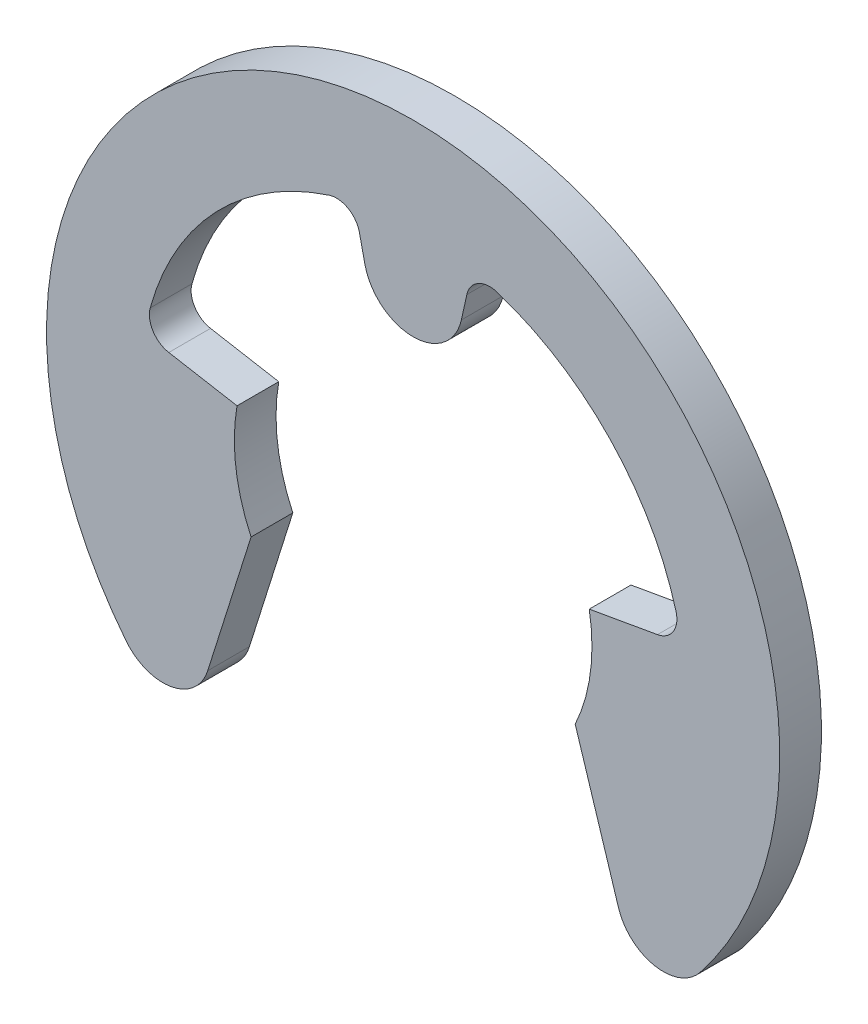
ISO-10303-21;
HEADER;
FILE_DESCRIPTION(('STEP AP214'),'2;1');
FILE_NAME('part.step','',(''),(''),'','','');
FILE_SCHEMA(('AUTOMOTIVE_DESIGN { 1 0 10303 214 1 1 1 1 }'));
ENDSEC;
DATA;
#1=APPLICATION_CONTEXT('core data for automotive mechanical design processes');
#2=APPLICATION_PROTOCOL_DEFINITION('international standard','automotive_design',2000,#1);
#3=PRODUCT_CONTEXT('',#1,'mechanical');
#4=PRODUCT('Part','Part','',(#3));
#5=PRODUCT_RELATED_PRODUCT_CATEGORY('part','',(#4));
#6=PRODUCT_DEFINITION_FORMATION('','',#4);
#7=PRODUCT_DEFINITION_CONTEXT('part definition',#1,'design');
#8=PRODUCT_DEFINITION('design','',#6,#7);
#9=PRODUCT_DEFINITION_SHAPE('','',#8);
#10=(LENGTH_UNIT() NAMED_UNIT(*) SI_UNIT(.MILLI.,.METRE.));
#11=(NAMED_UNIT(*) PLANE_ANGLE_UNIT() SI_UNIT($,.RADIAN.));
#12=(NAMED_UNIT(*) SI_UNIT($,.STERADIAN.) SOLID_ANGLE_UNIT());
#13=UNCERTAINTY_MEASURE_WITH_UNIT(LENGTH_MEASURE(1.E-05),#10,'distance_accuracy_value','');
#14=(GEOMETRIC_REPRESENTATION_CONTEXT(3) GLOBAL_UNCERTAINTY_ASSIGNED_CONTEXT((#13)) GLOBAL_UNIT_ASSIGNED_CONTEXT((#10,
#11,#12)) REPRESENTATION_CONTEXT('',''));
#15=CARTESIAN_POINT('',(0.,0.,0.));
#16=DIRECTION('',(0.,0.,1.));
#17=DIRECTION('',(1.,0.,0.));
#18=AXIS2_PLACEMENT_3D('',#15,#16,#17);
#19=CARTESIAN_POINT('',(0.,0.,-0.7));
#20=DIRECTION('',(0.,0.,1.));
#21=DIRECTION('',(1.,0.,0.));
#22=AXIS2_PLACEMENT_3D('',#19,#20,#21);
#23=CYLINDRICAL_SURFACE('',#22,3.);
#24=CARTESIAN_POINT('',(0.,0.,0.));
#25=DIRECTION('',(0.,0.,-1.));
#26=DIRECTION('',(1.,0.,0.));
#27=AXIS2_PLACEMENT_3D('',#24,#25,#26);
#28=CIRCLE('',#27,3.);
#29=CARTESIAN_POINT('',(2.95442325903663,0.520944533000782,0.));
#30=VERTEX_POINT('',#29);
#31=CARTESIAN_POINT('',(2.71892336110994,-1.26785478522211,0.));
#32=VERTEX_POINT('',#31);
#33=EDGE_CURVE('E198',#30,#32,#28,.T.);
#34=ORIENTED_EDGE('',*,*,#33,.F.);
#35=DIRECTION('',(0.,0.,1.));
#36=VECTOR('',#35,1.);
#37=CARTESIAN_POINT('',(2.95442325903663,0.520944533000782,-0.7));
#38=LINE('',#37,#36);
#39=CARTESIAN_POINT('',(2.95442325903663,0.520944533000782,-0.7));
#40=VERTEX_POINT('',#39);
#41=EDGE_CURVE('E11',#40,#30,#38,.T.);
#42=ORIENTED_EDGE('',*,*,#41,.F.);
#43=CARTESIAN_POINT('',(0.,0.,-0.7));
#44=DIRECTION('',(0.,0.,-1.));
#45=DIRECTION('',(1.,0.,0.));
#46=AXIS2_PLACEMENT_3D('',#43,#44,#45);
#47=CIRCLE('',#46,3.);
#48=CARTESIAN_POINT('',(2.71892336110994,-1.26785478522211,-0.7));
#49=VERTEX_POINT('',#48);
#50=EDGE_CURVE('E248',#40,#49,#47,.T.);
#51=ORIENTED_EDGE('',*,*,#50,.T.);
#52=DIRECTION('',(0.,0.,1.));
#53=VECTOR('',#52,1.);
#54=CARTESIAN_POINT('',(2.71892336110994,-1.26785478522211,-0.7));
#55=LINE('',#54,#53);
#56=EDGE_CURVE('E44',#49,#32,#55,.T.);
#57=ORIENTED_EDGE('',*,*,#56,.T.);
#58=EDGE_LOOP('',(#34,#42,#51,#57));
#59=FACE_BOUND('',#58,.T.);
#60=ADVANCED_FACE('F41',(#59),#23,.F.);
#61=CARTESIAN_POINT('',(2.95442325903663,0.520944533000782,-0.7));
#62=DIRECTION('',(-0.173648177666928,0.984807753012209,0.));
#63=DIRECTION('',(-0.984807753012209,-0.173648177666928,0.));
#64=AXIS2_PLACEMENT_3D('',#61,#62,#63);
#65=PLANE('',#64);
#66=DIRECTION('',(-0.984807753012209,-0.173648177666928,0.));
#67=VECTOR('',#66,1.);
#68=CARTESIAN_POINT('',(2.95442325903663,0.520944533000782,0.));
#69=LINE('',#68,#67);
#70=CARTESIAN_POINT('',(4.09942862119905,0.722839871405881,0.));
#71=VERTEX_POINT('',#70);
#72=EDGE_CURVE('E246',#71,#30,#69,.T.);
#73=ORIENTED_EDGE('',*,*,#72,.F.);
#74=DIRECTION('',(0.,0.,1.));
#75=VECTOR('',#74,1.);
#76=CARTESIAN_POINT('',(4.09942862119905,0.722839871405881,-0.7));
#77=LINE('',#76,#75);
#78=CARTESIAN_POINT('',(4.09942862119905,0.722839871405881,-0.7));
#79=VERTEX_POINT('',#78);
#80=EDGE_CURVE('E50',#79,#71,#77,.T.);
#81=ORIENTED_EDGE('',*,*,#80,.F.);
#82=DIRECTION('',(-0.984807753012209,-0.173648177666928,0.));
#83=VECTOR('',#82,1.);
#84=CARTESIAN_POINT('',(2.95442325903663,0.520944533000782,-0.7));
#85=LINE('',#84,#83);
#86=EDGE_CURVE('E188',#79,#40,#85,.T.);
#87=ORIENTED_EDGE('',*,*,#86,.T.);
#88=ORIENTED_EDGE('',*,*,#41,.T.);
#89=EDGE_LOOP('',(#73,#81,#87,#88));
#90=FACE_BOUND('',#89,.T.);
#91=ADVANCED_FACE('F280',(#90),#65,.T.);
#92=CARTESIAN_POINT('',(4.0310546512427,1.11060792415444,-0.7));
#93=DIRECTION('',(0.,0.,1.));
#94=DIRECTION('',(1.,0.,0.));
#95=AXIS2_PLACEMENT_3D('',#92,#93,#94);
#96=CYLINDRICAL_SURFACE('',#95,0.39375);
#97=CARTESIAN_POINT('',(4.0310546512427,1.11060792415444,0.));
#98=DIRECTION('',(0.,0.,-1.));
#99=DIRECTION('',(1.,0.,0.));
#100=AXIS2_PLACEMENT_3D('',#97,#98,#99);
#101=CIRCLE('',#100,0.39375);
#102=CARTESIAN_POINT('',(4.41066069463326,1.21519432059948,0.));
#103=VERTEX_POINT('',#102);
#104=EDGE_CURVE('E175',#103,#71,#101,.T.);
#105=ORIENTED_EDGE('',*,*,#104,.F.);
#106=DIRECTION('',(0.,0.,1.));
#107=VECTOR('',#106,1.);
#108=CARTESIAN_POINT('',(4.41066069463326,1.21519432059948,-0.7));
#109=LINE('',#108,#107);
#110=CARTESIAN_POINT('',(4.41066069463326,1.21519432059948,-0.7));
#111=VERTEX_POINT('',#110);
#112=EDGE_CURVE('E170',#111,#103,#109,.T.);
#113=ORIENTED_EDGE('',*,*,#112,.F.);
#114=CARTESIAN_POINT('',(4.0310546512427,1.11060792415444,-0.7));
#115=DIRECTION('',(0.,0.,-1.));
#116=DIRECTION('',(1.,0.,0.));
#117=AXIS2_PLACEMENT_3D('',#114,#115,#116);
#118=CIRCLE('',#117,0.39375);
#119=EDGE_CURVE('E173',#111,#79,#118,.T.);
#120=ORIENTED_EDGE('',*,*,#119,.T.);
#121=ORIENTED_EDGE('',*,*,#80,.T.);
#122=EDGE_LOOP('',(#105,#113,#120,#121));
#123=FACE_BOUND('',#122,.T.);
#124=ADVANCED_FACE('F172',(#123),#96,.F.);
#125=CARTESIAN_POINT('',(0.,0.,-0.7));
#126=DIRECTION('',(0.,0.,1.));
#127=DIRECTION('',(1.,0.,0.));
#128=AXIS2_PLACEMENT_3D('',#125,#126,#127);
#129=CYLINDRICAL_SURFACE('',#128,4.575);
#130=CARTESIAN_POINT('',(0.,0.,0.));
#131=DIRECTION('',(0.,0.,-1.));
#132=DIRECTION('',(1.,0.,0.));
#133=AXIS2_PLACEMENT_3D('',#130,#131,#132);
#134=CIRCLE('',#133,4.575);
#135=CARTESIAN_POINT('',(1.40642804224757,4.35345669117997,0.));
#136=VERTEX_POINT('',#135);
#137=EDGE_CURVE('E243',#136,#103,#134,.T.);
#138=ORIENTED_EDGE('',*,*,#137,.F.);
#139=DIRECTION('',(0.,0.,1.));
#140=VECTOR('',#139,1.);
#141=CARTESIAN_POINT('',(1.40642804224757,4.35345669117997,-0.7));
#142=LINE('',#141,#140);
#143=CARTESIAN_POINT('',(1.40642804224757,4.35345669117997,-0.7));
#144=VERTEX_POINT('',#143);
#145=EDGE_CURVE('E180',#144,#136,#142,.T.);
#146=ORIENTED_EDGE('',*,*,#145,.F.);
#147=CARTESIAN_POINT('',(0.,0.,-0.7));
#148=DIRECTION('',(0.,0.,-1.));
#149=DIRECTION('',(1.,0.,0.));
#150=AXIS2_PLACEMENT_3D('',#147,#148,#149);
#151=CIRCLE('',#150,4.575);
#152=EDGE_CURVE('E186',#144,#111,#151,.T.);
#153=ORIENTED_EDGE('',*,*,#152,.T.);
#154=ORIENTED_EDGE('',*,*,#112,.T.);
#155=EDGE_LOOP('',(#138,#146,#153,#154));
#156=FACE_BOUND('',#155,.T.);
#157=ADVANCED_FACE('F190',(#156),#129,.F.);
#158=CARTESIAN_POINT('',(1.28538300582462,3.97877394316858,-0.7));
#159=DIRECTION('',(0.,0.,1.));
#160=DIRECTION('',(1.,0.,0.));
#161=AXIS2_PLACEMENT_3D('',#158,#159,#160);
#162=CYLINDRICAL_SURFACE('',#161,0.39375);
#163=CARTESIAN_POINT('',(1.28538300582462,3.97877394316858,0.));
#164=DIRECTION('',(0.,0.,-1.));
#165=DIRECTION('',(1.,0.,0.));
#166=AXIS2_PLACEMENT_3D('',#163,#164,#165);
#167=CIRCLE('',#166,0.39375);
#168=CARTESIAN_POINT('',(0.900966453021147,4.06399704115671,0.));
#169=VERTEX_POINT('',#168);
#170=EDGE_CURVE('E240',#169,#136,#167,.T.);
#171=ORIENTED_EDGE('',*,*,#170,.F.);
#172=DIRECTION('',(0.,0.,1.));
#173=VECTOR('',#172,1.);
#174=CARTESIAN_POINT('',(0.900966453021147,4.06399704115671,-0.7));
#175=LINE('',#174,#173);
#176=CARTESIAN_POINT('',(0.900966453021147,4.06399704115671,-0.7));
#177=VERTEX_POINT('',#176);
#178=EDGE_CURVE('E252',#177,#169,#175,.T.);
#179=ORIENTED_EDGE('',*,*,#178,.F.);
#180=CARTESIAN_POINT('',(1.28538300582462,3.97877394316858,-0.7));
#181=DIRECTION('',(0.,0.,-1.));
#182=DIRECTION('',(1.,0.,0.));
#183=AXIS2_PLACEMENT_3D('',#180,#181,#182);
#184=CIRCLE('',#183,0.39375);
#185=EDGE_CURVE('E191',#177,#144,#184,.T.);
#186=ORIENTED_EDGE('',*,*,#185,.T.);
#187=ORIENTED_EDGE('',*,*,#145,.T.);
#188=EDGE_LOOP('',(#171,#179,#186,#187));
#189=FACE_BOUND('',#188,.T.);
#190=ADVANCED_FACE('F293',(#189),#162,.F.);
#191=CARTESIAN_POINT('',(0.809034509512549,3.6493188418143,-0.7));
#192=DIRECTION('',(0.976296007119933,-0.216439613938103,0.));
#193=DIRECTION('',(0.216439613938103,0.976296007119933,0.));
#194=AXIS2_PLACEMENT_3D('',#191,#192,#193);
#195=PLANE('',#194);
#196=DIRECTION('',(0.216439613938103,0.976296007119933,0.));
#197=VECTOR('',#196,1.);
#198=CARTESIAN_POINT('',(0.809034509512549,3.6493188418143,0.));
#199=LINE('',#198,#197);
#200=CARTESIAN_POINT('',(0.809034509512549,3.6493188418143,0.));
#201=VERTEX_POINT('',#200);
#202=EDGE_CURVE('E237',#201,#169,#199,.T.);
#203=ORIENTED_EDGE('',*,*,#202,.F.);
#204=DIRECTION('',(0.,0.,1.));
#205=VECTOR('',#204,1.);
#206=CARTESIAN_POINT('',(0.809034509512549,3.6493188418143,-0.7));
#207=LINE('',#206,#205);
#208=CARTESIAN_POINT('',(0.809034509512549,3.6493188418143,-0.7));
#209=VERTEX_POINT('',#208);
#210=EDGE_CURVE('E254',#209,#201,#207,.T.);
#211=ORIENTED_EDGE('',*,*,#210,.F.);
#212=DIRECTION('',(0.216439613938103,0.976296007119933,0.));
#213=VECTOR('',#212,1.);
#214=CARTESIAN_POINT('',(0.809034509512549,3.6493188418143,-0.7));
#215=LINE('',#214,#213);
#216=EDGE_CURVE('E193',#209,#177,#215,.T.);
#217=ORIENTED_EDGE('',*,*,#216,.T.);
#218=ORIENTED_EDGE('',*,*,#178,.T.);
#219=EDGE_LOOP('',(#203,#211,#217,#218));
#220=FACE_BOUND('',#219,.T.);
#221=ADVANCED_FACE('F296',(#220),#195,.T.);
#222=CARTESIAN_POINT('',(0.,3.82867747446718,-0.7));
#223=DIRECTION('',(0.,0.,1.));
#224=DIRECTION('',(1.,0.,0.));
#225=AXIS2_PLACEMENT_3D('',#222,#223,#224);
#226=CYLINDRICAL_SURFACE('',#225,0.828677474467191);
#227=CARTESIAN_POINT('',(0.,3.82867747446718,0.));
#228=DIRECTION('',(0.,0.,1.));
#229=DIRECTION('',(1.,0.,0.));
#230=AXIS2_PLACEMENT_3D('',#227,#228,#229);
#231=CIRCLE('',#230,0.828677474467191);
#232=CARTESIAN_POINT('',(-0.809034509512549,3.6493188418143,0.));
#233=VERTEX_POINT('',#232);
#234=EDGE_CURVE('E234',#233,#201,#231,.T.);
#235=ORIENTED_EDGE('',*,*,#234,.F.);
#236=DIRECTION('',(0.,0.,1.));
#237=VECTOR('',#236,1.);
#238=CARTESIAN_POINT('',(-0.809034509512549,3.6493188418143,-0.7));
#239=LINE('',#238,#237);
#240=CARTESIAN_POINT('',(-0.809034509512549,3.6493188418143,-0.7));
#241=VERTEX_POINT('',#240);
#242=EDGE_CURVE('E256',#241,#233,#239,.T.);
#243=ORIENTED_EDGE('',*,*,#242,.F.);
#244=CARTESIAN_POINT('',(0.,3.82867747446718,-0.7));
#245=DIRECTION('',(0.,0.,1.));
#246=DIRECTION('',(1.,0.,0.));
#247=AXIS2_PLACEMENT_3D('',#244,#245,#246);
#248=CIRCLE('',#247,0.828677474467191);
#249=EDGE_CURVE('E464',#241,#209,#248,.T.);
#250=ORIENTED_EDGE('',*,*,#249,.T.);
#251=ORIENTED_EDGE('',*,*,#210,.T.);
#252=EDGE_LOOP('',(#235,#243,#250,#251));
#253=FACE_BOUND('',#252,.T.);
#254=ADVANCED_FACE('F300',(#253),#226,.T.);
#255=CARTESIAN_POINT('',(-0.809034509512549,3.6493188418143,-0.7));
#256=DIRECTION('',(-0.976296007119933,-0.216439613938103,0.));
#257=DIRECTION('',(0.216439613938103,-0.976296007119933,0.));
#258=AXIS2_PLACEMENT_3D('',#255,#256,#257);
#259=PLANE('',#258);
#260=DIRECTION('',(0.216439613938103,-0.976296007119933,0.));
#261=VECTOR('',#260,1.);
#262=CARTESIAN_POINT('',(-0.809034509512549,3.6493188418143,0.));
#263=LINE('',#262,#261);
#264=CARTESIAN_POINT('',(-0.900966453021146,4.06399704115671,0.));
#265=VERTEX_POINT('',#264);
#266=EDGE_CURVE('E231',#265,#233,#263,.T.);
#267=ORIENTED_EDGE('',*,*,#266,.F.);
#268=DIRECTION('',(0.,0.,1.));
#269=VECTOR('',#268,1.);
#270=CARTESIAN_POINT('',(-0.900966453021146,4.06399704115671,-0.7));
#271=LINE('',#270,#269);
#272=CARTESIAN_POINT('',(-0.900966453021146,4.06399704115671,-0.7));
#273=VERTEX_POINT('',#272);
#274=EDGE_CURVE('E258',#273,#265,#271,.T.);
#275=ORIENTED_EDGE('',*,*,#274,.F.);
#276=DIRECTION('',(0.216439613938103,-0.976296007119933,0.));
#277=VECTOR('',#276,1.);
#278=CARTESIAN_POINT('',(-0.809034509512549,3.6493188418143,-0.7));
#279=LINE('',#278,#277);
#280=EDGE_CURVE('E468',#273,#241,#279,.T.);
#281=ORIENTED_EDGE('',*,*,#280,.T.);
#282=ORIENTED_EDGE('',*,*,#242,.T.);
#283=EDGE_LOOP('',(#267,#275,#281,#282));
#284=FACE_BOUND('',#283,.T.);
#285=ADVANCED_FACE('F304',(#284),#259,.T.);
#286=CARTESIAN_POINT('',(-1.28538300582462,3.97877394316858,-0.7));
#287=DIRECTION('',(0.,0.,1.));
#288=DIRECTION('',(1.,0.,0.));
#289=AXIS2_PLACEMENT_3D('',#286,#287,#288);
#290=CYLINDRICAL_SURFACE('',#289,0.39375);
#291=CARTESIAN_POINT('',(-1.28538300582462,3.97877394316858,0.));
#292=DIRECTION('',(0.,0.,-1.));
#293=DIRECTION('',(1.,0.,0.));
#294=AXIS2_PLACEMENT_3D('',#291,#292,#293);
#295=CIRCLE('',#294,0.39375);
#296=CARTESIAN_POINT('',(-1.40642804224757,4.35345669117997,0.));
#297=VERTEX_POINT('',#296);
#298=EDGE_CURVE('E228',#297,#265,#295,.T.);
#299=ORIENTED_EDGE('',*,*,#298,.F.);
#300=DIRECTION('',(0.,0.,1.));
#301=VECTOR('',#300,1.);
#302=CARTESIAN_POINT('',(-1.40642804224757,4.35345669117997,-0.7));
#303=LINE('',#302,#301);
#304=CARTESIAN_POINT('',(-1.40642804224757,4.35345669117997,-0.7));
#305=VERTEX_POINT('',#304);
#306=EDGE_CURVE('E260',#305,#297,#303,.T.);
#307=ORIENTED_EDGE('',*,*,#306,.F.);
#308=CARTESIAN_POINT('',(-1.28538300582462,3.97877394316858,-0.7));
#309=DIRECTION('',(0.,0.,-1.));
#310=DIRECTION('',(1.,0.,0.));
#311=AXIS2_PLACEMENT_3D('',#308,#309,#310);
#312=CIRCLE('',#311,0.39375);
#313=EDGE_CURVE('E457',#305,#273,#312,.T.);
#314=ORIENTED_EDGE('',*,*,#313,.T.);
#315=ORIENTED_EDGE('',*,*,#274,.T.);
#316=EDGE_LOOP('',(#299,#307,#314,#315));
#317=FACE_BOUND('',#316,.T.);
#318=ADVANCED_FACE('F308',(#317),#290,.F.);
#319=CARTESIAN_POINT('',(0.,0.,-0.7));
#320=DIRECTION('',(0.,0.,1.));
#321=DIRECTION('',(1.,0.,0.));
#322=AXIS2_PLACEMENT_3D('',#319,#320,#321);
#323=CYLINDRICAL_SURFACE('',#322,4.575);
#324=CARTESIAN_POINT('',(0.,0.,0.));
#325=DIRECTION('',(0.,0.,-1.));
#326=DIRECTION('',(1.,0.,0.));
#327=AXIS2_PLACEMENT_3D('',#324,#325,#326);
#328=CIRCLE('',#327,4.575);
#329=CARTESIAN_POINT('',(-4.41066069463326,1.21519432059948,0.));
#330=VERTEX_POINT('',#329);
#331=EDGE_CURVE('E225',#330,#297,#328,.T.);
#332=ORIENTED_EDGE('',*,*,#331,.F.);
#333=DIRECTION('',(0.,0.,1.));
#334=VECTOR('',#333,1.);
#335=CARTESIAN_POINT('',(-4.41066069463326,1.21519432059948,-0.7));
#336=LINE('',#335,#334);
#337=CARTESIAN_POINT('',(-4.41066069463326,1.21519432059948,-0.7));
#338=VERTEX_POINT('',#337);
#339=EDGE_CURVE('E262',#338,#330,#336,.T.);
#340=ORIENTED_EDGE('',*,*,#339,.F.);
#341=CARTESIAN_POINT('',(0.,0.,-0.7));
#342=DIRECTION('',(0.,0.,-1.));
#343=DIRECTION('',(1.,0.,0.));
#344=AXIS2_PLACEMENT_3D('',#341,#342,#343);
#345=CIRCLE('',#344,4.575);
#346=EDGE_CURVE('E453',#338,#305,#345,.T.);
#347=ORIENTED_EDGE('',*,*,#346,.T.);
#348=ORIENTED_EDGE('',*,*,#306,.T.);
#349=EDGE_LOOP('',(#332,#340,#347,#348));
#350=FACE_BOUND('',#349,.T.);
#351=ADVANCED_FACE('F312',(#350),#323,.F.);
#352=CARTESIAN_POINT('',(-4.0310546512427,1.11060792415444,-0.7));
#353=DIRECTION('',(0.,0.,1.));
#354=DIRECTION('',(1.,0.,0.));
#355=AXIS2_PLACEMENT_3D('',#352,#353,#354);
#356=CYLINDRICAL_SURFACE('',#355,0.39375);
#357=CARTESIAN_POINT('',(-4.0310546512427,1.11060792415444,0.));
#358=DIRECTION('',(0.,0.,-1.));
#359=DIRECTION('',(1.,0.,0.));
#360=AXIS2_PLACEMENT_3D('',#357,#358,#359);
#361=CIRCLE('',#360,0.39375);
#362=CARTESIAN_POINT('',(-4.09942862119905,0.722839871405881,0.));
#363=VERTEX_POINT('',#362);
#364=EDGE_CURVE('E222',#363,#330,#361,.T.);
#365=ORIENTED_EDGE('',*,*,#364,.F.);
#366=DIRECTION('',(0.,0.,1.));
#367=VECTOR('',#366,1.);
#368=CARTESIAN_POINT('',(-4.09942862119905,0.722839871405881,-0.7));
#369=LINE('',#368,#367);
#370=CARTESIAN_POINT('',(-4.09942862119905,0.722839871405881,-0.7));
#371=VERTEX_POINT('',#370);
#372=EDGE_CURVE('E264',#371,#363,#369,.T.);
#373=ORIENTED_EDGE('',*,*,#372,.F.);
#374=CARTESIAN_POINT('',(-4.0310546512427,1.11060792415444,-0.7));
#375=DIRECTION('',(0.,0.,-1.));
#376=DIRECTION('',(1.,0.,0.));
#377=AXIS2_PLACEMENT_3D('',#374,#375,#376);
#378=CIRCLE('',#377,0.39375);
#379=EDGE_CURVE('E474',#371,#338,#378,.T.);
#380=ORIENTED_EDGE('',*,*,#379,.T.);
#381=ORIENTED_EDGE('',*,*,#339,.T.);
#382=EDGE_LOOP('',(#365,#373,#380,#381));
#383=FACE_BOUND('',#382,.T.);
#384=ADVANCED_FACE('F316',(#383),#356,.F.);
#385=CARTESIAN_POINT('',(-2.95442325903663,0.520944533000782,-0.7));
#386=DIRECTION('',(0.173648177666928,0.984807753012209,0.));
#387=DIRECTION('',(-0.984807753012209,0.173648177666928,0.));
#388=AXIS2_PLACEMENT_3D('',#385,#386,#387);
#389=PLANE('',#388);
#390=DIRECTION('',(-0.984807753012209,0.173648177666928,0.));
#391=VECTOR('',#390,1.);
#392=CARTESIAN_POINT('',(-2.95442325903663,0.520944533000782,0.));
#393=LINE('',#392,#391);
#394=CARTESIAN_POINT('',(-2.95442325903663,0.520944533000782,0.));
#395=VERTEX_POINT('',#394);
#396=EDGE_CURVE('E219',#395,#363,#393,.T.);
#397=ORIENTED_EDGE('',*,*,#396,.F.);
#398=DIRECTION('',(0.,0.,1.));
#399=VECTOR('',#398,1.);
#400=CARTESIAN_POINT('',(-2.95442325903663,0.520944533000782,-0.7));
#401=LINE('',#400,#399);
#402=CARTESIAN_POINT('',(-2.95442325903663,0.520944533000782,-0.7));
#403=VERTEX_POINT('',#402);
#404=EDGE_CURVE('E266',#403,#395,#401,.T.);
#405=ORIENTED_EDGE('',*,*,#404,.F.);
#406=DIRECTION('',(-0.984807753012209,0.173648177666928,0.));
#407=VECTOR('',#406,1.);
#408=CARTESIAN_POINT('',(-2.95442325903663,0.520944533000782,-0.7));
#409=LINE('',#408,#407);
#410=EDGE_CURVE('E446',#403,#371,#409,.T.);
#411=ORIENTED_EDGE('',*,*,#410,.T.);
#412=ORIENTED_EDGE('',*,*,#372,.T.);
#413=EDGE_LOOP('',(#397,#405,#411,#412));
#414=FACE_BOUND('',#413,.T.);
#415=ADVANCED_FACE('F320',(#414),#389,.T.);
#416=CARTESIAN_POINT('',(0.,0.,-0.7));
#417=DIRECTION('',(0.,0.,1.));
#418=DIRECTION('',(1.,0.,0.));
#419=AXIS2_PLACEMENT_3D('',#416,#417,#418);
#420=CYLINDRICAL_SURFACE('',#419,3.);
#421=CARTESIAN_POINT('',(0.,0.,0.));
#422=DIRECTION('',(0.,0.,-1.));
#423=DIRECTION('',(1.,0.,0.));
#424=AXIS2_PLACEMENT_3D('',#421,#422,#423);
#425=CIRCLE('',#424,3.);
#426=CARTESIAN_POINT('',(-2.71892336110994,-1.26785478522211,0.));
#427=VERTEX_POINT('',#426);
#428=EDGE_CURVE('E216',#427,#395,#425,.T.);
#429=ORIENTED_EDGE('',*,*,#428,.F.);
#430=DIRECTION('',(0.,0.,1.));
#431=VECTOR('',#430,1.);
#432=CARTESIAN_POINT('',(-2.71892336110994,-1.26785478522211,-0.7));
#433=LINE('',#432,#431);
#434=CARTESIAN_POINT('',(-2.71892336110994,-1.26785478522211,-0.7));
#435=VERTEX_POINT('',#434);
#436=EDGE_CURVE('E268',#435,#427,#433,.T.);
#437=ORIENTED_EDGE('',*,*,#436,.F.);
#438=CARTESIAN_POINT('',(0.,0.,-0.7));
#439=DIRECTION('',(0.,0.,-1.));
#440=DIRECTION('',(1.,0.,0.));
#441=AXIS2_PLACEMENT_3D('',#438,#439,#440);
#442=CIRCLE('',#441,3.);
#443=EDGE_CURVE('E442',#435,#403,#442,.T.);
#444=ORIENTED_EDGE('',*,*,#443,.T.);
#445=ORIENTED_EDGE('',*,*,#404,.T.);
#446=EDGE_LOOP('',(#429,#437,#444,#445));
#447=FACE_BOUND('',#446,.T.);
#448=ADVANCED_FACE('F324',(#447),#420,.F.);
#449=CARTESIAN_POINT('',(-2.71892336110994,-1.26785478522211,-0.7));
#450=DIRECTION('',(0.953716950748227,-0.300705799504273,0.));
#451=DIRECTION('',(0.300705799504273,0.953716950748227,0.));
#452=AXIS2_PLACEMENT_3D('',#449,#450,#451);
#453=PLANE('',#452);
#454=DIRECTION('',(0.300705799504273,0.953716950748227,0.));
#455=VECTOR('',#454,1.);
#456=CARTESIAN_POINT('',(-2.71892336110994,-1.26785478522211,0.));
#457=LINE('',#456,#455);
#458=CARTESIAN_POINT('',(-3.44617975649715,-3.57441738881757,0.));
#459=VERTEX_POINT('',#458);
#460=EDGE_CURVE('E213',#459,#427,#457,.T.);
#461=ORIENTED_EDGE('',*,*,#460,.F.);
#462=DIRECTION('',(0.,0.,1.));
#463=VECTOR('',#462,1.);
#464=CARTESIAN_POINT('',(-3.44617975649715,-3.57441738881757,-0.7));
#465=LINE('',#464,#463);
#466=CARTESIAN_POINT('',(-3.44617975649715,-3.57441738881757,-0.7));
#467=VERTEX_POINT('',#466);
#468=EDGE_CURVE('E270',#467,#459,#465,.T.);
#469=ORIENTED_EDGE('',*,*,#468,.F.);
#470=DIRECTION('',(0.300705799504273,0.953716950748227,0.));
#471=VECTOR('',#470,1.);
#472=CARTESIAN_POINT('',(-2.71892336110994,-1.26785478522211,-0.7));
#473=LINE('',#472,#471);
#474=EDGE_CURVE('E478',#467,#435,#473,.T.);
#475=ORIENTED_EDGE('',*,*,#474,.T.);
#476=ORIENTED_EDGE('',*,*,#436,.T.);
#477=EDGE_LOOP('',(#461,#469,#475,#476));
#478=FACE_BOUND('',#477,.T.);
#479=ADVANCED_FACE('F328',(#478),#453,.T.);
#480=CARTESIAN_POINT('',(-4.19723185521138,-3.33761157170796,-0.7));
#481=DIRECTION('',(0.,0.,1.));
#482=DIRECTION('',(1.,0.,0.));
#483=AXIS2_PLACEMENT_3D('',#480,#481,#482);
#484=CYLINDRICAL_SURFACE('',#483,0.7875);
#485=CARTESIAN_POINT('',(-4.19723185521138,-3.33761157170796,0.));
#486=DIRECTION('',(0.,0.,1.));
#487=DIRECTION('',(1.,0.,0.));
#488=AXIS2_PLACEMENT_3D('',#485,#486,#487);
#489=CIRCLE('',#488,0.7875);
#490=CARTESIAN_POINT('',(-4.81360856122144,-3.82775033398675,0.));
#491=VERTEX_POINT('',#490);
#492=EDGE_CURVE('E210',#491,#459,#489,.T.);
#493=ORIENTED_EDGE('',*,*,#492,.F.);
#494=DIRECTION('',(0.,0.,1.));
#495=VECTOR('',#494,1.);
#496=CARTESIAN_POINT('',(-4.81360856122144,-3.82775033398675,-0.7));
#497=LINE('',#496,#495);
#498=CARTESIAN_POINT('',(-4.81360856122144,-3.82775033398675,-0.7));
#499=VERTEX_POINT('',#498);
#500=EDGE_CURVE('E272',#499,#491,#497,.T.);
#501=ORIENTED_EDGE('',*,*,#500,.F.);
#502=CARTESIAN_POINT('',(-4.19723185521138,-3.33761157170796,-0.7));
#503=DIRECTION('',(0.,0.,1.));
#504=DIRECTION('',(1.,0.,0.));
#505=AXIS2_PLACEMENT_3D('',#502,#503,#504);
#506=CIRCLE('',#505,0.7875);
#507=EDGE_CURVE('E435',#499,#467,#506,.T.);
#508=ORIENTED_EDGE('',*,*,#507,.T.);
#509=ORIENTED_EDGE('',*,*,#468,.T.);
#510=EDGE_LOOP('',(#493,#501,#508,#509));
#511=FACE_BOUND('',#510,.T.);
#512=ADVANCED_FACE('F332',(#511),#484,.T.);
#513=CARTESIAN_POINT('',(0.,0.,-0.7));
#514=DIRECTION('',(0.,0.,1.));
#515=DIRECTION('',(1.,0.,0.));
#516=AXIS2_PLACEMENT_3D('',#513,#514,#515);
#517=CYLINDRICAL_SURFACE('',#516,6.15);
#518=CARTESIAN_POINT('',(0.,0.,0.));
#519=DIRECTION('',(0.,0.,1.));
#520=DIRECTION('',(1.,0.,0.));
#521=AXIS2_PLACEMENT_3D('',#518,#519,#520);
#522=CIRCLE('',#521,6.15);
#523=CARTESIAN_POINT('',(4.81360856122144,-3.82775033398675,0.));
#524=VERTEX_POINT('',#523);
#525=EDGE_CURVE('E207',#524,#491,#522,.T.);
#526=ORIENTED_EDGE('',*,*,#525,.F.);
#527=DIRECTION('',(0.,0.,1.));
#528=VECTOR('',#527,1.);
#529=CARTESIAN_POINT('',(4.81360856122144,-3.82775033398675,-0.7));
#530=LINE('',#529,#528);
#531=CARTESIAN_POINT('',(4.81360856122144,-3.82775033398675,-0.7));
#532=VERTEX_POINT('',#531);
#533=EDGE_CURVE('E274',#532,#524,#530,.T.);
#534=ORIENTED_EDGE('',*,*,#533,.F.);
#535=CARTESIAN_POINT('',(0.,0.,-0.7));
#536=DIRECTION('',(0.,0.,1.));
#537=DIRECTION('',(1.,0.,0.));
#538=AXIS2_PLACEMENT_3D('',#535,#536,#537);
#539=CIRCLE('',#538,6.15);
#540=EDGE_CURVE('E431',#532,#499,#539,.T.);
#541=ORIENTED_EDGE('',*,*,#540,.T.);
#542=ORIENTED_EDGE('',*,*,#500,.T.);
#543=EDGE_LOOP('',(#526,#534,#541,#542));
#544=FACE_BOUND('',#543,.T.);
#545=ADVANCED_FACE('F336',(#544),#517,.T.);
#546=CARTESIAN_POINT('',(4.19723185521138,-3.33761157170796,-0.7));
#547=DIRECTION('',(0.,0.,1.));
#548=DIRECTION('',(1.,0.,0.));
#549=AXIS2_PLACEMENT_3D('',#546,#547,#548);
#550=CYLINDRICAL_SURFACE('',#549,0.7875);
#551=CARTESIAN_POINT('',(4.19723185521138,-3.33761157170796,0.));
#552=DIRECTION('',(0.,0.,1.));
#553=DIRECTION('',(1.,0.,0.));
#554=AXIS2_PLACEMENT_3D('',#551,#552,#553);
#555=CIRCLE('',#554,0.7875);
#556=CARTESIAN_POINT('',(3.44617975649715,-3.57441738881757,0.));
#557=VERTEX_POINT('',#556);
#558=EDGE_CURVE('E204',#557,#524,#555,.T.);
#559=ORIENTED_EDGE('',*,*,#558,.F.);
#560=DIRECTION('',(0.,0.,1.));
#561=VECTOR('',#560,1.);
#562=CARTESIAN_POINT('',(3.44617975649715,-3.57441738881757,-0.7));
#563=LINE('',#562,#561);
#564=CARTESIAN_POINT('',(3.44617975649715,-3.57441738881757,-0.7));
#565=VERTEX_POINT('',#564);
#566=EDGE_CURVE('E275',#565,#557,#563,.T.);
#567=ORIENTED_EDGE('',*,*,#566,.F.);
#568=CARTESIAN_POINT('',(4.19723185521138,-3.33761157170796,-0.7));
#569=DIRECTION('',(0.,0.,1.));
#570=DIRECTION('',(1.,0.,0.));
#571=AXIS2_PLACEMENT_3D('',#568,#569,#570);
#572=CIRCLE('',#571,0.7875);
#573=EDGE_CURVE('E482',#565,#532,#572,.T.);
#574=ORIENTED_EDGE('',*,*,#573,.T.);
#575=ORIENTED_EDGE('',*,*,#533,.T.);
#576=EDGE_LOOP('',(#559,#567,#574,#575));
#577=FACE_BOUND('',#576,.T.);
#578=ADVANCED_FACE('F340',(#577),#550,.T.);
#579=CARTESIAN_POINT('',(2.71892336110994,-1.26785478522211,-0.7));
#580=DIRECTION('',(-0.953716950748227,-0.300705799504273,0.));
#581=DIRECTION('',(0.300705799504273,-0.953716950748227,0.));
#582=AXIS2_PLACEMENT_3D('',#579,#580,#581);
#583=PLANE('',#582);
#584=DIRECTION('',(0.300705799504273,-0.953716950748227,0.));
#585=VECTOR('',#584,1.);
#586=CARTESIAN_POINT('',(2.71892336110994,-1.26785478522211,0.));
#587=LINE('',#586,#585);
#588=EDGE_CURVE('E201',#32,#557,#587,.T.);
#589=ORIENTED_EDGE('',*,*,#588,.F.);
#590=ORIENTED_EDGE('',*,*,#56,.F.);
#591=DIRECTION('',(0.300705799504273,-0.953716950748227,0.));
#592=VECTOR('',#591,1.);
#593=CARTESIAN_POINT('',(2.71892336110994,-1.26785478522211,-0.7));
#594=LINE('',#593,#592);
#595=EDGE_CURVE('E484',#49,#565,#594,.T.);
#596=ORIENTED_EDGE('',*,*,#595,.T.);
#597=ORIENTED_EDGE('',*,*,#566,.T.);
#598=EDGE_LOOP('',(#589,#590,#596,#597));
#599=FACE_BOUND('',#598,.T.);
#600=ADVANCED_FACE('F277',(#599),#583,.T.);
#601=CARTESIAN_POINT('',(0.,0.,-0.7));
#602=DIRECTION('',(0.,0.,1.));
#603=DIRECTION('',(1.,0.,0.));
#604=AXIS2_PLACEMENT_3D('',#601,#602,#603);
#605=PLANE('',#604);
#606=ORIENTED_EDGE('',*,*,#50,.F.);
#607=ORIENTED_EDGE('',*,*,#86,.F.);
#608=ORIENTED_EDGE('',*,*,#119,.F.);
#609=ORIENTED_EDGE('',*,*,#152,.F.);
#610=ORIENTED_EDGE('',*,*,#185,.F.);
#611=ORIENTED_EDGE('',*,*,#216,.F.);
#612=ORIENTED_EDGE('',*,*,#249,.F.);
#613=ORIENTED_EDGE('',*,*,#280,.F.);
#614=ORIENTED_EDGE('',*,*,#313,.F.);
#615=ORIENTED_EDGE('',*,*,#346,.F.);
#616=ORIENTED_EDGE('',*,*,#379,.F.);
#617=ORIENTED_EDGE('',*,*,#410,.F.);
#618=ORIENTED_EDGE('',*,*,#443,.F.);
#619=ORIENTED_EDGE('',*,*,#474,.F.);
#620=ORIENTED_EDGE('',*,*,#507,.F.);
#621=ORIENTED_EDGE('',*,*,#540,.F.);
#622=ORIENTED_EDGE('',*,*,#573,.F.);
#623=ORIENTED_EDGE('',*,*,#595,.F.);
#624=EDGE_LOOP('',(#606,#607,#608,#609,#610,#611,#612,#613,#614,#615,#616,#617,#618,#619,#620,
#621,#622,#623));
#625=FACE_BOUND('',#624,.T.);
#626=ADVANCED_FACE('F184',(#625),#605,.F.);
#627=CARTESIAN_POINT('',(0.,0.,0.));
#628=DIRECTION('',(0.,0.,1.));
#629=DIRECTION('',(1.,0.,0.));
#630=AXIS2_PLACEMENT_3D('',#627,#628,#629);
#631=PLANE('',#630);
#632=ORIENTED_EDGE('',*,*,#33,.T.);
#633=ORIENTED_EDGE('',*,*,#588,.T.);
#634=ORIENTED_EDGE('',*,*,#558,.T.);
#635=ORIENTED_EDGE('',*,*,#525,.T.);
#636=ORIENTED_EDGE('',*,*,#492,.T.);
#637=ORIENTED_EDGE('',*,*,#460,.T.);
#638=ORIENTED_EDGE('',*,*,#428,.T.);
#639=ORIENTED_EDGE('',*,*,#396,.T.);
#640=ORIENTED_EDGE('',*,*,#364,.T.);
#641=ORIENTED_EDGE('',*,*,#331,.T.);
#642=ORIENTED_EDGE('',*,*,#298,.T.);
#643=ORIENTED_EDGE('',*,*,#266,.T.);
#644=ORIENTED_EDGE('',*,*,#234,.T.);
#645=ORIENTED_EDGE('',*,*,#202,.T.);
#646=ORIENTED_EDGE('',*,*,#170,.T.);
#647=ORIENTED_EDGE('',*,*,#137,.T.);
#648=ORIENTED_EDGE('',*,*,#104,.T.);
#649=ORIENTED_EDGE('',*,*,#72,.T.);
#650=EDGE_LOOP('',(#632,#633,#634,#635,#636,#637,#638,#639,#640,#641,#642,#643,#644,#645,#646,
#647,#648,#649));
#651=FACE_BOUND('',#650,.T.);
#652=ADVANCED_FACE('F279',(#651),#631,.T.);
#653=CLOSED_SHELL('',(#60,#91,#124,#157,#190,#221,#254,#285,#318,#351,#384,#415,#448,#479,#512,
#545,#578,#600,#626,#652));
#654=MANIFOLD_SOLID_BREP('B2',#653);
#655=ADVANCED_BREP_SHAPE_REPRESENTATION('',(#18,#654),#14);
#656=SHAPE_DEFINITION_REPRESENTATION(#9,#655);
ENDSEC;
END-ISO-10303-21;
